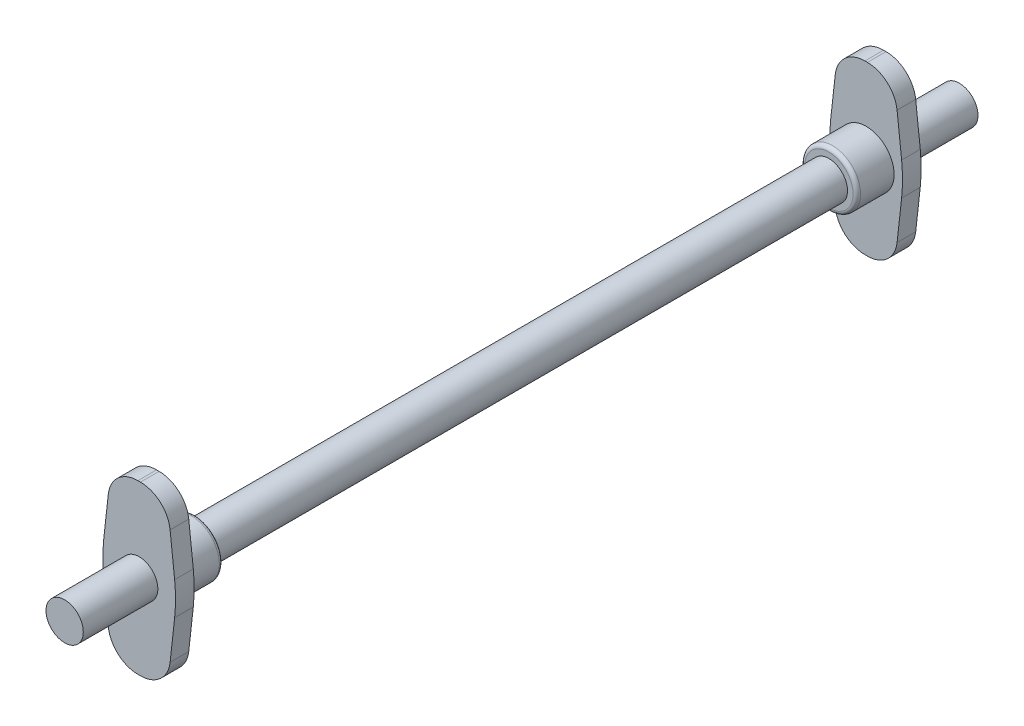
ISO-10303-21;
HEADER;
FILE_DESCRIPTION(('STEP AP214'),'2;1');
FILE_NAME('part.step','',(''),(''),'','','');
FILE_SCHEMA(('AUTOMOTIVE_DESIGN { 1 0 10303 214 1 1 1 1 }'));
ENDSEC;
DATA;
#1=APPLICATION_CONTEXT('core data for automotive mechanical design processes');
#2=APPLICATION_PROTOCOL_DEFINITION('international standard','automotive_design',2000,#1);
#3=PRODUCT_CONTEXT('',#1,'mechanical');
#4=PRODUCT('Part','Part','',(#3));
#5=PRODUCT_RELATED_PRODUCT_CATEGORY('part','',(#4));
#6=PRODUCT_DEFINITION_FORMATION('','',#4);
#7=PRODUCT_DEFINITION_CONTEXT('part definition',#1,'design');
#8=PRODUCT_DEFINITION('design','',#6,#7);
#9=PRODUCT_DEFINITION_SHAPE('','',#8);
#10=(LENGTH_UNIT() NAMED_UNIT(*) SI_UNIT(.MILLI.,.METRE.));
#11=(NAMED_UNIT(*) PLANE_ANGLE_UNIT() SI_UNIT($,.RADIAN.));
#12=(NAMED_UNIT(*) SI_UNIT($,.STERADIAN.) SOLID_ANGLE_UNIT());
#13=UNCERTAINTY_MEASURE_WITH_UNIT(LENGTH_MEASURE(1.E-05),#10,'distance_accuracy_value','');
#14=(GEOMETRIC_REPRESENTATION_CONTEXT(3) GLOBAL_UNCERTAINTY_ASSIGNED_CONTEXT((#13)) GLOBAL_UNIT_ASSIGNED_CONTEXT((#10,
#11,#12)) REPRESENTATION_CONTEXT('',''));
#15=CARTESIAN_POINT('',(0.,0.,0.));
#16=DIRECTION('',(0.,0.,1.));
#17=DIRECTION('',(1.,0.,0.));
#18=AXIS2_PLACEMENT_3D('',#15,#16,#17);
#19=CARTESIAN_POINT('',(0.,0.,53.975));
#20=DIRECTION('',(0.,0.,-1.));
#21=DIRECTION('',(-1.,0.,0.));
#22=AXIS2_PLACEMENT_3D('',#19,#20,#21);
#23=CYLINDRICAL_SURFACE('',#22,3.175);
#24=CARTESIAN_POINT('',(0.,0.,53.975));
#25=DIRECTION('',(0.,0.,1.));
#26=DIRECTION('',(1.,0.,0.));
#27=AXIS2_PLACEMENT_3D('',#24,#25,#26);
#28=CIRCLE('',#27,3.175);
#29=CARTESIAN_POINT('',(3.175,0.,53.975));
#30=VERTEX_POINT('',#29);
#31=EDGE_CURVE('E249',#30,#30,#28,.T.);
#32=ORIENTED_EDGE('',*,*,#31,.F.);
#33=EDGE_LOOP('',(#32));
#34=FACE_BOUND('',#33,.T.);
#35=CARTESIAN_POINT('',(0.,0.,-53.975));
#36=DIRECTION('',(0.,0.,1.));
#37=DIRECTION('',(1.,0.,0.));
#38=AXIS2_PLACEMENT_3D('',#35,#36,#37);
#39=CIRCLE('',#38,3.175);
#40=CARTESIAN_POINT('',(3.175,0.,-53.975));
#41=VERTEX_POINT('',#40);
#42=EDGE_CURVE('E177',#41,#41,#39,.T.);
#43=ORIENTED_EDGE('',*,*,#42,.T.);
#44=EDGE_LOOP('',(#43));
#45=FACE_BOUND('',#44,.T.);
#46=ADVANCED_FACE('F41',(#34,#45),#23,.T.);
#47=CARTESIAN_POINT('',(0.,0.,60.325));
#48=DIRECTION('',(0.,0.,-1.));
#49=DIRECTION('',(-1.,0.,0.));
#50=AXIS2_PLACEMENT_3D('',#47,#48,#49);
#51=CYLINDRICAL_SURFACE('',#50,4.7625);
#52=CARTESIAN_POINT('',(0.,0.,54.61));
#53=DIRECTION('',(0.,0.,1.));
#54=DIRECTION('',(1.,0.,0.));
#55=AXIS2_PLACEMENT_3D('',#52,#53,#54);
#56=CIRCLE('',#55,4.7625);
#57=CARTESIAN_POINT('',(4.7625,0.,54.61));
#58=VERTEX_POINT('',#57);
#59=EDGE_CURVE('E253',#58,#58,#56,.T.);
#60=ORIENTED_EDGE('',*,*,#59,.T.);
#61=EDGE_LOOP('',(#60));
#62=FACE_BOUND('',#61,.T.);
#63=CARTESIAN_POINT('',(0.,0.,60.325));
#64=DIRECTION('',(0.,0.,1.));
#65=DIRECTION('',(1.,0.,0.));
#66=AXIS2_PLACEMENT_3D('',#63,#64,#65);
#67=CIRCLE('',#66,4.7625);
#68=CARTESIAN_POINT('',(4.7625,0.,60.325));
#69=VERTEX_POINT('',#68);
#70=EDGE_CURVE('E245',#69,#69,#67,.T.);
#71=ORIENTED_EDGE('',*,*,#70,.F.);
#72=EDGE_LOOP('',(#71));
#73=FACE_BOUND('',#72,.T.);
#74=ADVANCED_FACE('F346',(#62,#73),#51,.T.);
#75=CARTESIAN_POINT('',(0.,0.,53.975));
#76=DIRECTION('',(0.,0.,1.));
#77=DIRECTION('',(1.,0.,0.));
#78=AXIS2_PLACEMENT_3D('',#75,#76,#77);
#79=PLANE('',#78);
#80=CARTESIAN_POINT('',(0.,0.,53.975));
#81=DIRECTION('',(0.,0.,1.));
#82=DIRECTION('',(1.,0.,0.));
#83=AXIS2_PLACEMENT_3D('',#80,#81,#82);
#84=CIRCLE('',#83,4.1275);
#85=CARTESIAN_POINT('',(4.1275,0.,53.975));
#86=VERTEX_POINT('',#85);
#87=EDGE_CURVE('E257',#86,#86,#84,.F.);
#88=ORIENTED_EDGE('',*,*,#87,.T.);
#89=EDGE_LOOP('',(#88));
#90=FACE_BOUND('',#89,.T.);
#91=ORIENTED_EDGE('',*,*,#31,.T.);
#92=EDGE_LOOP('',(#91));
#93=FACE_BOUND('',#92,.T.);
#94=ADVANCED_FACE('F352',(#90,#93),#79,.F.);
#95=CARTESIAN_POINT('',(-0.215682610917992,-9.2075,63.5));
#96=DIRECTION('',(0.,0.,-1.));
#97=DIRECTION('',(-1.,0.,0.));
#98=AXIS2_PLACEMENT_3D('',#95,#96,#97);
#99=CYLINDRICAL_SURFACE('',#98,5.08);
#100=CARTESIAN_POINT('',(-0.215682610917992,-9.2075,60.325));
#101=DIRECTION('',(0.,0.,1.));
#102=DIRECTION('',(-1.,0.,0.));
#103=AXIS2_PLACEMENT_3D('',#100,#101,#102);
#104=CIRCLE('',#103,5.08);
#105=CARTESIAN_POINT('',(-5.26461198305998,-9.76849215246019,60.325));
#106=VERTEX_POINT('',#105);
#107=CARTESIAN_POINT('',(-0.215682610917959,-14.2875,60.325));
#108=VERTEX_POINT('',#107);
#109=EDGE_CURVE('E172',#106,#108,#104,.T.);
#110=ORIENTED_EDGE('',*,*,#109,.T.);
#111=DIRECTION('',(0.,0.,-1.));
#112=VECTOR('',#111,1.);
#113=CARTESIAN_POINT('',(-0.215682610917959,-14.2875,63.5));
#114=LINE('',#113,#112);
#115=CARTESIAN_POINT('',(-0.215682610917959,-14.2875,63.5));
#116=VERTEX_POINT('',#115);
#117=EDGE_CURVE('E242',#116,#108,#114,.T.);
#118=ORIENTED_EDGE('',*,*,#117,.F.);
#119=CARTESIAN_POINT('',(-0.215682610917992,-9.2075,63.5));
#120=DIRECTION('',(0.,0.,1.));
#121=DIRECTION('',(-1.,0.,0.));
#122=AXIS2_PLACEMENT_3D('',#119,#120,#121);
#123=CIRCLE('',#122,5.08);
#124=CARTESIAN_POINT('',(-5.26461198305998,-9.76849215246019,63.5));
#125=VERTEX_POINT('',#124);
#126=EDGE_CURVE('E207',#125,#116,#123,.T.);
#127=ORIENTED_EDGE('',*,*,#126,.F.);
#128=DIRECTION('',(0.,0.,-1.));
#129=VECTOR('',#128,1.);
#130=CARTESIAN_POINT('',(-5.26461198305998,-9.76849215246019,63.5));
#131=LINE('',#130,#129);
#132=EDGE_CURVE('E168',#125,#106,#131,.T.);
#133=ORIENTED_EDGE('',*,*,#132,.T.);
#134=EDGE_LOOP('',(#110,#118,#127,#133));
#135=FACE_BOUND('',#134,.T.);
#136=ADVANCED_FACE('F332',(#135),#99,.T.);
#137=CARTESIAN_POINT('',(0.215682610917958,-14.2875,63.5));
#138=DIRECTION('',(0.,1.,0.));
#139=DIRECTION('',(0.,0.,1.));
#140=AXIS2_PLACEMENT_3D('',#137,#138,#139);
#141=PLANE('',#140);
#142=DIRECTION('',(1.,0.,0.));
#143=VECTOR('',#142,1.);
#144=CARTESIAN_POINT('',(0.215682610917958,-14.2875,60.325));
#145=LINE('',#144,#143);
#146=CARTESIAN_POINT('',(0.215682610917958,-14.2875,60.325));
#147=VERTEX_POINT('',#146);
#148=EDGE_CURVE('E176',#108,#147,#145,.T.);
#149=ORIENTED_EDGE('',*,*,#148,.T.);
#150=DIRECTION('',(0.,0.,-1.));
#151=VECTOR('',#150,1.);
#152=CARTESIAN_POINT('',(0.215682610917958,-14.2875,63.5));
#153=LINE('',#152,#151);
#154=CARTESIAN_POINT('',(0.215682610917958,-14.2875,63.5));
#155=VERTEX_POINT('',#154);
#156=EDGE_CURVE('E238',#155,#147,#153,.T.);
#157=ORIENTED_EDGE('',*,*,#156,.F.);
#158=DIRECTION('',(1.,0.,0.));
#159=VECTOR('',#158,1.);
#160=CARTESIAN_POINT('',(0.215682610917958,-14.2875,63.5));
#161=LINE('',#160,#159);
#162=EDGE_CURVE('E116',#116,#155,#161,.T.);
#163=ORIENTED_EDGE('',*,*,#162,.F.);
#164=ORIENTED_EDGE('',*,*,#117,.T.);
#165=EDGE_LOOP('',(#149,#157,#163,#164));
#166=FACE_BOUND('',#165,.T.);
#167=ADVANCED_FACE('F878',(#166),#141,.F.);
#168=CARTESIAN_POINT('',(0.21568261091799,-9.2075,63.5));
#169=DIRECTION('',(0.,0.,-1.));
#170=DIRECTION('',(-1.,0.,0.));
#171=AXIS2_PLACEMENT_3D('',#168,#169,#170);
#172=CYLINDRICAL_SURFACE('',#171,5.08);
#173=CARTESIAN_POINT('',(0.21568261091799,-9.2075,60.325));
#174=DIRECTION('',(0.,0.,1.));
#175=DIRECTION('',(-1.,0.,0.));
#176=AXIS2_PLACEMENT_3D('',#173,#174,#175);
#177=CIRCLE('',#176,5.08);
#178=CARTESIAN_POINT('',(5.26461198305998,-9.76849215246019,60.325));
#179=VERTEX_POINT('',#178);
#180=EDGE_CURVE('E180',#147,#179,#177,.T.);
#181=ORIENTED_EDGE('',*,*,#180,.T.);
#182=DIRECTION('',(0.,0.,-1.));
#183=VECTOR('',#182,1.);
#184=CARTESIAN_POINT('',(5.26461198305998,-9.76849215246019,63.5));
#185=LINE('',#184,#183);
#186=CARTESIAN_POINT('',(5.26461198305998,-9.76849215246019,63.5));
#187=VERTEX_POINT('',#186);
#188=EDGE_CURVE('E234',#187,#179,#185,.T.);
#189=ORIENTED_EDGE('',*,*,#188,.F.);
#190=CARTESIAN_POINT('',(0.21568261091799,-9.2075,63.5));
#191=DIRECTION('',(0.,0.,1.));
#192=DIRECTION('',(-1.,0.,0.));
#193=AXIS2_PLACEMENT_3D('',#190,#191,#192);
#194=CIRCLE('',#193,5.08);
#195=EDGE_CURVE('E298',#155,#187,#194,.T.);
#196=ORIENTED_EDGE('',*,*,#195,.F.);
#197=ORIENTED_EDGE('',*,*,#156,.T.);
#198=EDGE_LOOP('',(#181,#189,#196,#197));
#199=FACE_BOUND('',#198,.T.);
#200=ADVANCED_FACE('F884',(#199),#172,.T.);
#201=CARTESIAN_POINT('',(6.03833769307764,-2.80496076230119,63.5));
#202=DIRECTION('',(-0.993883734673619,0.110431526074847,0.));
#203=DIRECTION('',(-0.110431526074847,-0.993883734673619,0.));
#204=AXIS2_PLACEMENT_3D('',#201,#202,#203);
#205=PLANE('',#204);
#206=DIRECTION('',(0.110431526074847,0.993883734673619,0.));
#207=VECTOR('',#206,1.);
#208=CARTESIAN_POINT('',(6.03833769307764,-2.80496076230119,60.325));
#209=LINE('',#208,#207);
#210=CARTESIAN_POINT('',(6.03833769307764,-2.80496076230119,60.325));
#211=VERTEX_POINT('',#210);
#212=EDGE_CURVE('E183',#179,#211,#209,.T.);
#213=ORIENTED_EDGE('',*,*,#212,.T.);
#214=DIRECTION('',(0.,0.,-1.));
#215=VECTOR('',#214,1.);
#216=CARTESIAN_POINT('',(6.03833769307764,-2.80496076230119,63.5));
#217=LINE('',#216,#215);
#218=CARTESIAN_POINT('',(6.03833769307764,-2.80496076230119,63.5));
#219=VERTEX_POINT('',#218);
#220=EDGE_CURVE('E230',#219,#211,#217,.T.);
#221=ORIENTED_EDGE('',*,*,#220,.F.);
#222=DIRECTION('',(0.110431526074847,0.993883734673619,0.));
#223=VECTOR('',#222,1.);
#224=CARTESIAN_POINT('',(6.03833769307764,-2.80496076230119,63.5));
#225=LINE('',#224,#223);
#226=EDGE_CURVE('E301',#187,#219,#225,.T.);
#227=ORIENTED_EDGE('',*,*,#226,.F.);
#228=ORIENTED_EDGE('',*,*,#188,.T.);
#229=EDGE_LOOP('',(#213,#221,#227,#228));
#230=FACE_BOUND('',#229,.T.);
#231=ADVANCED_FACE('F891',(#230),#205,.F.);
#232=CARTESIAN_POINT('',(-19.2063091676323,0.,63.5));
#233=DIRECTION('',(0.,0.,-1.));
#234=DIRECTION('',(-1.,0.,0.));
#235=AXIS2_PLACEMENT_3D('',#232,#233,#234);
#236=CYLINDRICAL_SURFACE('',#235,25.4);
#237=CARTESIAN_POINT('',(-19.2063091676323,0.,60.325));
#238=DIRECTION('',(0.,0.,1.));
#239=DIRECTION('',(-1.,0.,0.));
#240=AXIS2_PLACEMENT_3D('',#237,#238,#239);
#241=CIRCLE('',#240,25.4);
#242=CARTESIAN_POINT('',(6.03833769307765,2.80496076230119,60.325));
#243=VERTEX_POINT('',#242);
#244=EDGE_CURVE('E186',#211,#243,#241,.T.);
#245=ORIENTED_EDGE('',*,*,#244,.T.);
#246=DIRECTION('',(0.,0.,-1.));
#247=VECTOR('',#246,1.);
#248=CARTESIAN_POINT('',(6.03833769307765,2.80496076230119,63.5));
#249=LINE('',#248,#247);
#250=CARTESIAN_POINT('',(6.03833769307765,2.80496076230119,63.5));
#251=VERTEX_POINT('',#250);
#252=EDGE_CURVE('E226',#251,#243,#249,.T.);
#253=ORIENTED_EDGE('',*,*,#252,.F.);
#254=CARTESIAN_POINT('',(-19.2063091676323,0.,63.5));
#255=DIRECTION('',(0.,0.,1.));
#256=DIRECTION('',(-1.,0.,0.));
#257=AXIS2_PLACEMENT_3D('',#254,#255,#256);
#258=CIRCLE('',#257,25.4);
#259=EDGE_CURVE('E304',#219,#251,#258,.T.);
#260=ORIENTED_EDGE('',*,*,#259,.F.);
#261=ORIENTED_EDGE('',*,*,#220,.T.);
#262=EDGE_LOOP('',(#245,#253,#260,#261));
#263=FACE_BOUND('',#262,.T.);
#264=ADVANCED_FACE('F899',(#263),#236,.T.);
#265=CARTESIAN_POINT('',(5.26461198305998,9.76849215246018,63.5));
#266=DIRECTION('',(-0.993883734673619,-0.110431526074846,0.));
#267=DIRECTION('',(0.110431526074846,-0.993883734673619,0.));
#268=AXIS2_PLACEMENT_3D('',#265,#266,#267);
#269=PLANE('',#268);
#270=DIRECTION('',(-0.110431526074846,0.993883734673619,0.));
#271=VECTOR('',#270,1.);
#272=CARTESIAN_POINT('',(5.26461198305998,9.76849215246018,60.325));
#273=LINE('',#272,#271);
#274=CARTESIAN_POINT('',(5.26461198305998,9.76849215246018,60.325));
#275=VERTEX_POINT('',#274);
#276=EDGE_CURVE('E189',#243,#275,#273,.T.);
#277=ORIENTED_EDGE('',*,*,#276,.T.);
#278=DIRECTION('',(0.,0.,-1.));
#279=VECTOR('',#278,1.);
#280=CARTESIAN_POINT('',(5.26461198305998,9.76849215246018,63.5));
#281=LINE('',#280,#279);
#282=CARTESIAN_POINT('',(5.26461198305998,9.76849215246018,63.5));
#283=VERTEX_POINT('',#282);
#284=EDGE_CURVE('E222',#283,#275,#281,.T.);
#285=ORIENTED_EDGE('',*,*,#284,.F.);
#286=DIRECTION('',(-0.110431526074846,0.993883734673619,0.));
#287=VECTOR('',#286,1.);
#288=CARTESIAN_POINT('',(5.26461198305998,9.76849215246018,63.5));
#289=LINE('',#288,#287);
#290=EDGE_CURVE('E307',#251,#283,#289,.T.);
#291=ORIENTED_EDGE('',*,*,#290,.F.);
#292=ORIENTED_EDGE('',*,*,#252,.T.);
#293=EDGE_LOOP('',(#277,#285,#291,#292));
#294=FACE_BOUND('',#293,.T.);
#295=ADVANCED_FACE('F907',(#294),#269,.F.);
#296=CARTESIAN_POINT('',(0.215682610917991,9.2075,63.5));
#297=DIRECTION('',(0.,0.,-1.));
#298=DIRECTION('',(-1.,0.,0.));
#299=AXIS2_PLACEMENT_3D('',#296,#297,#298);
#300=CYLINDRICAL_SURFACE('',#299,5.08);
#301=CARTESIAN_POINT('',(0.215682610917991,9.2075,60.325));
#302=DIRECTION('',(0.,0.,1.));
#303=DIRECTION('',(-1.,0.,0.));
#304=AXIS2_PLACEMENT_3D('',#301,#302,#303);
#305=CIRCLE('',#304,5.08);
#306=CARTESIAN_POINT('',(0.215682610917958,14.2875,60.325));
#307=VERTEX_POINT('',#306);
#308=EDGE_CURVE('E192',#275,#307,#305,.T.);
#309=ORIENTED_EDGE('',*,*,#308,.T.);
#310=DIRECTION('',(0.,0.,-1.));
#311=VECTOR('',#310,1.);
#312=CARTESIAN_POINT('',(0.215682610917958,14.2875,63.5));
#313=LINE('',#312,#311);
#314=CARTESIAN_POINT('',(0.215682610917958,14.2875,63.5));
#315=VERTEX_POINT('',#314);
#316=EDGE_CURVE('E218',#315,#307,#313,.T.);
#317=ORIENTED_EDGE('',*,*,#316,.F.);
#318=CARTESIAN_POINT('',(0.215682610917991,9.2075,63.5));
#319=DIRECTION('',(0.,0.,1.));
#320=DIRECTION('',(-1.,0.,0.));
#321=AXIS2_PLACEMENT_3D('',#318,#319,#320);
#322=CIRCLE('',#321,5.08);
#323=EDGE_CURVE('E310',#283,#315,#322,.T.);
#324=ORIENTED_EDGE('',*,*,#323,.F.);
#325=ORIENTED_EDGE('',*,*,#284,.T.);
#326=EDGE_LOOP('',(#309,#317,#324,#325));
#327=FACE_BOUND('',#326,.T.);
#328=ADVANCED_FACE('F915',(#327),#300,.T.);
#329=CARTESIAN_POINT('',(-0.215682610917959,14.2875,63.5));
#330=DIRECTION('',(0.,-1.,0.));
#331=DIRECTION('',(0.,0.,-1.));
#332=AXIS2_PLACEMENT_3D('',#329,#330,#331);
#333=PLANE('',#332);
#334=DIRECTION('',(-1.,0.,0.));
#335=VECTOR('',#334,1.);
#336=CARTESIAN_POINT('',(-0.215682610917959,14.2875,60.325));
#337=LINE('',#336,#335);
#338=CARTESIAN_POINT('',(-0.215682610917959,14.2875,60.325));
#339=VERTEX_POINT('',#338);
#340=EDGE_CURVE('E195',#307,#339,#337,.T.);
#341=ORIENTED_EDGE('',*,*,#340,.T.);
#342=DIRECTION('',(0.,0.,-1.));
#343=VECTOR('',#342,1.);
#344=CARTESIAN_POINT('',(-0.215682610917959,14.2875,63.5));
#345=LINE('',#344,#343);
#346=CARTESIAN_POINT('',(-0.215682610917959,14.2875,63.5));
#347=VERTEX_POINT('',#346);
#348=EDGE_CURVE('E214',#347,#339,#345,.T.);
#349=ORIENTED_EDGE('',*,*,#348,.F.);
#350=DIRECTION('',(-1.,0.,0.));
#351=VECTOR('',#350,1.);
#352=CARTESIAN_POINT('',(-0.215682610917959,14.2875,63.5));
#353=LINE('',#352,#351);
#354=EDGE_CURVE('E313',#315,#347,#353,.T.);
#355=ORIENTED_EDGE('',*,*,#354,.F.);
#356=ORIENTED_EDGE('',*,*,#316,.T.);
#357=EDGE_LOOP('',(#341,#349,#355,#356));
#358=FACE_BOUND('',#357,.T.);
#359=ADVANCED_FACE('F321',(#358),#333,.F.);
#360=CARTESIAN_POINT('',(-0.215682610917992,9.2075,63.5));
#361=DIRECTION('',(0.,0.,-1.));
#362=DIRECTION('',(-1.,0.,0.));
#363=AXIS2_PLACEMENT_3D('',#360,#361,#362);
#364=CYLINDRICAL_SURFACE('',#363,5.08);
#365=CARTESIAN_POINT('',(-0.215682610917992,9.2075,60.325));
#366=DIRECTION('',(0.,0.,1.));
#367=DIRECTION('',(1.,0.,0.));
#368=AXIS2_PLACEMENT_3D('',#365,#366,#367);
#369=CIRCLE('',#368,5.08);
#370=CARTESIAN_POINT('',(-5.26461198305998,9.76849215246019,60.325));
#371=VERTEX_POINT('',#370);
#372=EDGE_CURVE('E198',#339,#371,#369,.T.);
#373=ORIENTED_EDGE('',*,*,#372,.T.);
#374=DIRECTION('',(0.,0.,-1.));
#375=VECTOR('',#374,1.);
#376=CARTESIAN_POINT('',(-5.26461198305998,9.76849215246019,63.5));
#377=LINE('',#376,#375);
#378=CARTESIAN_POINT('',(-5.26461198305998,9.76849215246019,63.5));
#379=VERTEX_POINT('',#378);
#380=EDGE_CURVE('E161',#379,#371,#377,.T.);
#381=ORIENTED_EDGE('',*,*,#380,.F.);
#382=CARTESIAN_POINT('',(-0.215682610917992,9.2075,63.5));
#383=DIRECTION('',(0.,0.,1.));
#384=DIRECTION('',(1.,0.,0.));
#385=AXIS2_PLACEMENT_3D('',#382,#383,#384);
#386=CIRCLE('',#385,5.08);
#387=EDGE_CURVE('E150',#347,#379,#386,.T.);
#388=ORIENTED_EDGE('',*,*,#387,.F.);
#389=ORIENTED_EDGE('',*,*,#348,.T.);
#390=EDGE_LOOP('',(#373,#381,#388,#389));
#391=FACE_BOUND('',#390,.T.);
#392=ADVANCED_FACE('F325',(#391),#364,.T.);
#393=CARTESIAN_POINT('',(-6.03833769307765,2.8049607623012,63.5));
#394=DIRECTION('',(0.993883734673619,-0.110431526074847,0.));
#395=DIRECTION('',(0.110431526074847,0.993883734673619,0.));
#396=AXIS2_PLACEMENT_3D('',#393,#394,#395);
#397=PLANE('',#396);
#398=DIRECTION('',(-0.110431526074847,-0.993883734673619,0.));
#399=VECTOR('',#398,1.);
#400=CARTESIAN_POINT('',(-6.03833769307765,2.8049607623012,60.325));
#401=LINE('',#400,#399);
#402=CARTESIAN_POINT('',(-6.03833769307765,2.8049607623012,60.325));
#403=VERTEX_POINT('',#402);
#404=EDGE_CURVE('E159',#371,#403,#401,.T.);
#405=ORIENTED_EDGE('',*,*,#404,.T.);
#406=DIRECTION('',(0.,0.,-1.));
#407=VECTOR('',#406,1.);
#408=CARTESIAN_POINT('',(-6.03833769307765,2.8049607623012,63.5));
#409=LINE('',#408,#407);
#410=CARTESIAN_POINT('',(-6.03833769307765,2.8049607623012,63.5));
#411=VERTEX_POINT('',#410);
#412=EDGE_CURVE('E156',#411,#403,#409,.T.);
#413=ORIENTED_EDGE('',*,*,#412,.F.);
#414=DIRECTION('',(-0.110431526074847,-0.993883734673619,0.));
#415=VECTOR('',#414,1.);
#416=CARTESIAN_POINT('',(-6.03833769307765,2.8049607623012,63.5));
#417=LINE('',#416,#415);
#418=EDGE_CURVE('E144',#379,#411,#417,.T.);
#419=ORIENTED_EDGE('',*,*,#418,.F.);
#420=ORIENTED_EDGE('',*,*,#380,.T.);
#421=EDGE_LOOP('',(#405,#413,#419,#420));
#422=FACE_BOUND('',#421,.T.);
#423=ADVANCED_FACE('F157',(#422),#397,.F.);
#424=CARTESIAN_POINT('',(19.2063091676323,0.,63.5));
#425=DIRECTION('',(0.,0.,-1.));
#426=DIRECTION('',(-1.,0.,0.));
#427=AXIS2_PLACEMENT_3D('',#424,#425,#426);
#428=CYLINDRICAL_SURFACE('',#427,25.4);
#429=CARTESIAN_POINT('',(19.2063091676323,0.,60.325));
#430=DIRECTION('',(0.,0.,1.));
#431=DIRECTION('',(-1.,0.,0.));
#432=AXIS2_PLACEMENT_3D('',#429,#430,#431);
#433=CIRCLE('',#432,25.4);
#434=CARTESIAN_POINT('',(-6.03833769307765,-2.8049607623012,60.325));
#435=VERTEX_POINT('',#434);
#436=EDGE_CURVE('E101',#403,#435,#433,.T.);
#437=ORIENTED_EDGE('',*,*,#436,.T.);
#438=DIRECTION('',(0.,0.,-1.));
#439=VECTOR('',#438,1.);
#440=CARTESIAN_POINT('',(-6.03833769307765,-2.8049607623012,63.5));
#441=LINE('',#440,#439);
#442=CARTESIAN_POINT('',(-6.03833769307765,-2.8049607623012,63.5));
#443=VERTEX_POINT('',#442);
#444=EDGE_CURVE('E162',#443,#435,#441,.T.);
#445=ORIENTED_EDGE('',*,*,#444,.F.);
#446=CARTESIAN_POINT('',(19.2063091676323,0.,63.5));
#447=DIRECTION('',(0.,0.,1.));
#448=DIRECTION('',(-1.,0.,0.));
#449=AXIS2_PLACEMENT_3D('',#446,#447,#448);
#450=CIRCLE('',#449,25.4);
#451=EDGE_CURVE('E148',#411,#443,#450,.T.);
#452=ORIENTED_EDGE('',*,*,#451,.F.);
#453=ORIENTED_EDGE('',*,*,#412,.T.);
#454=EDGE_LOOP('',(#437,#445,#452,#453));
#455=FACE_BOUND('',#454,.T.);
#456=ADVANCED_FACE('F164',(#455),#428,.T.);
#457=CARTESIAN_POINT('',(-5.26461198305998,-9.76849215246019,63.5));
#458=DIRECTION('',(0.993883734673619,0.110431526074847,0.));
#459=DIRECTION('',(-0.110431526074847,0.993883734673619,0.));
#460=AXIS2_PLACEMENT_3D('',#457,#458,#459);
#461=PLANE('',#460);
#462=DIRECTION('',(0.110431526074847,-0.993883734673619,0.));
#463=VECTOR('',#462,1.);
#464=CARTESIAN_POINT('',(-5.26461198305998,-9.76849215246019,60.325));
#465=LINE('',#464,#463);
#466=EDGE_CURVE('E107',#435,#106,#465,.T.);
#467=ORIENTED_EDGE('',*,*,#466,.T.);
#468=ORIENTED_EDGE('',*,*,#132,.F.);
#469=DIRECTION('',(0.110431526074847,-0.993883734673619,0.));
#470=VECTOR('',#469,1.);
#471=CARTESIAN_POINT('',(-5.26461198305998,-9.76849215246019,63.5));
#472=LINE('',#471,#470);
#473=EDGE_CURVE('E59',#443,#125,#472,.T.);
#474=ORIENTED_EDGE('',*,*,#473,.F.);
#475=ORIENTED_EDGE('',*,*,#444,.T.);
#476=EDGE_LOOP('',(#467,#468,#474,#475));
#477=FACE_BOUND('',#476,.T.);
#478=ADVANCED_FACE('F334',(#477),#461,.F.);
#479=CARTESIAN_POINT('',(-0.215682610917992,-9.2075,63.5));
#480=DIRECTION('',(0.,0.,-1.));
#481=DIRECTION('',(-1.,0.,0.));
#482=AXIS2_PLACEMENT_3D('',#479,#480,#481);
#483=PLANE('',#482);
#484=CARTESIAN_POINT('',(0.,0.,63.5));
#485=DIRECTION('',(0.,0.,-1.));
#486=DIRECTION('',(-1.,0.,0.));
#487=AXIS2_PLACEMENT_3D('',#484,#485,#486);
#488=CIRCLE('',#487,3.175);
#489=CARTESIAN_POINT('',(-3.175,0.,63.5));
#490=VERTEX_POINT('',#489);
#491=EDGE_CURVE('E11',#490,#490,#488,.F.);
#492=ORIENTED_EDGE('',*,*,#491,.F.);
#493=EDGE_LOOP('',(#492));
#494=FACE_BOUND('',#493,.T.);
#495=ORIENTED_EDGE('',*,*,#126,.T.);
#496=ORIENTED_EDGE('',*,*,#162,.T.);
#497=ORIENTED_EDGE('',*,*,#195,.T.);
#498=ORIENTED_EDGE('',*,*,#226,.T.);
#499=ORIENTED_EDGE('',*,*,#259,.T.);
#500=ORIENTED_EDGE('',*,*,#290,.T.);
#501=ORIENTED_EDGE('',*,*,#323,.T.);
#502=ORIENTED_EDGE('',*,*,#354,.T.);
#503=ORIENTED_EDGE('',*,*,#387,.T.);
#504=ORIENTED_EDGE('',*,*,#418,.T.);
#505=ORIENTED_EDGE('',*,*,#451,.T.);
#506=ORIENTED_EDGE('',*,*,#473,.T.);
#507=EDGE_LOOP('',(#495,#496,#497,#498,#499,#500,#501,#502,#503,#504,#505,#506));
#508=FACE_BOUND('',#507,.T.);
#509=ADVANCED_FACE('F146',(#494,#508),#483,.F.);
#510=CARTESIAN_POINT('',(-0.215682610917992,-9.2075,60.325));
#511=DIRECTION('',(0.,0.,-1.));
#512=DIRECTION('',(-1.,0.,0.));
#513=AXIS2_PLACEMENT_3D('',#510,#511,#512);
#514=PLANE('',#513);
#515=ORIENTED_EDGE('',*,*,#70,.T.);
#516=EDGE_LOOP('',(#515));
#517=FACE_BOUND('',#516,.T.);
#518=ORIENTED_EDGE('',*,*,#109,.F.);
#519=ORIENTED_EDGE('',*,*,#466,.F.);
#520=ORIENTED_EDGE('',*,*,#436,.F.);
#521=ORIENTED_EDGE('',*,*,#404,.F.);
#522=ORIENTED_EDGE('',*,*,#372,.F.);
#523=ORIENTED_EDGE('',*,*,#340,.F.);
#524=ORIENTED_EDGE('',*,*,#308,.F.);
#525=ORIENTED_EDGE('',*,*,#276,.F.);
#526=ORIENTED_EDGE('',*,*,#244,.F.);
#527=ORIENTED_EDGE('',*,*,#212,.F.);
#528=ORIENTED_EDGE('',*,*,#180,.F.);
#529=ORIENTED_EDGE('',*,*,#148,.F.);
#530=EDGE_LOOP('',(#518,#519,#520,#521,#522,#523,#524,#525,#526,#527,#528,#529));
#531=FACE_BOUND('',#530,.T.);
#532=ADVANCED_FACE('F328',(#517,#531),#514,.T.);
#533=CARTESIAN_POINT('',(0.,0.,-60.325));
#534=DIRECTION('',(0.,0.,1.));
#535=DIRECTION('',(1.,0.,0.));
#536=AXIS2_PLACEMENT_3D('',#533,#534,#535);
#537=CYLINDRICAL_SURFACE('',#536,4.7625);
#538=CARTESIAN_POINT('',(0.,0.,-54.61));
#539=DIRECTION('',(0.,0.,-1.));
#540=DIRECTION('',(-1.,0.,0.));
#541=AXIS2_PLACEMENT_3D('',#538,#539,#540);
#542=CIRCLE('',#541,4.7625);
#543=CARTESIAN_POINT('',(-4.7625,0.,-54.61));
#544=VERTEX_POINT('',#543);
#545=EDGE_CURVE('E51',#544,#544,#542,.T.);
#546=ORIENTED_EDGE('',*,*,#545,.T.);
#547=EDGE_LOOP('',(#546));
#548=FACE_BOUND('',#547,.T.);
#549=CARTESIAN_POINT('',(0.,0.,-60.325));
#550=DIRECTION('',(0.,0.,1.));
#551=DIRECTION('',(1.,0.,0.));
#552=AXIS2_PLACEMENT_3D('',#549,#550,#551);
#553=CIRCLE('',#552,4.7625);
#554=CARTESIAN_POINT('',(4.7625,0.,-60.325));
#555=VERTEX_POINT('',#554);
#556=EDGE_CURVE('E286',#555,#555,#553,.T.);
#557=ORIENTED_EDGE('',*,*,#556,.T.);
#558=EDGE_LOOP('',(#557));
#559=FACE_BOUND('',#558,.T.);
#560=ADVANCED_FACE('F268',(#548,#559),#537,.T.);
#561=CARTESIAN_POINT('',(0.,0.,-53.975));
#562=DIRECTION('',(0.,0.,-1.));
#563=DIRECTION('',(1.,0.,0.));
#564=AXIS2_PLACEMENT_3D('',#561,#562,#563);
#565=PLANE('',#564);
#566=CARTESIAN_POINT('',(0.,0.,-53.975));
#567=DIRECTION('',(0.,0.,-1.));
#568=DIRECTION('',(-1.,0.,0.));
#569=AXIS2_PLACEMENT_3D('',#566,#567,#568);
#570=CIRCLE('',#569,4.1275);
#571=CARTESIAN_POINT('',(-4.1275,0.,-53.975));
#572=VERTEX_POINT('',#571);
#573=EDGE_CURVE('E261',#572,#572,#570,.F.);
#574=ORIENTED_EDGE('',*,*,#573,.T.);
#575=EDGE_LOOP('',(#574));
#576=FACE_BOUND('',#575,.T.);
#577=ORIENTED_EDGE('',*,*,#42,.F.);
#578=EDGE_LOOP('',(#577));
#579=FACE_BOUND('',#578,.T.);
#580=ADVANCED_FACE('F277',(#576,#579),#565,.F.);
#581=CARTESIAN_POINT('',(-0.215682610917992,-9.2075,-63.5));
#582=DIRECTION('',(0.,0.,1.));
#583=DIRECTION('',(1.,0.,0.));
#584=AXIS2_PLACEMENT_3D('',#581,#582,#583);
#585=CYLINDRICAL_SURFACE('',#584,5.08);
#586=CARTESIAN_POINT('',(-0.215682610917992,-9.2075,-60.325));
#587=DIRECTION('',(0.,0.,1.));
#588=DIRECTION('',(-1.,0.,0.));
#589=AXIS2_PLACEMENT_3D('',#586,#587,#588);
#590=CIRCLE('',#589,5.08);
#591=CARTESIAN_POINT('',(-5.26461198305998,-9.76849215246019,-60.325));
#592=VERTEX_POINT('',#591);
#593=CARTESIAN_POINT('',(-0.215682610917959,-14.2875,-60.325));
#594=VERTEX_POINT('',#593);
#595=EDGE_CURVE('E454',#592,#594,#590,.T.);
#596=ORIENTED_EDGE('',*,*,#595,.F.);
#597=DIRECTION('',(0.,0.,1.));
#598=VECTOR('',#597,1.);
#599=CARTESIAN_POINT('',(-5.26461198305998,-9.76849215246019,-63.5));
#600=LINE('',#599,#598);
#601=CARTESIAN_POINT('',(-5.26461198305998,-9.76849215246019,-63.5));
#602=VERTEX_POINT('',#601);
#603=EDGE_CURVE('E290',#602,#592,#600,.T.);
#604=ORIENTED_EDGE('',*,*,#603,.F.);
#605=CARTESIAN_POINT('',(-0.215682610917992,-9.2075,-63.5));
#606=DIRECTION('',(0.,0.,1.));
#607=DIRECTION('',(-1.,0.,0.));
#608=AXIS2_PLACEMENT_3D('',#605,#606,#607);
#609=CIRCLE('',#608,5.08);
#610=CARTESIAN_POINT('',(-0.215682610917959,-14.2875,-63.5));
#611=VERTEX_POINT('',#610);
#612=EDGE_CURVE('E459',#602,#611,#609,.T.);
#613=ORIENTED_EDGE('',*,*,#612,.T.);
#614=DIRECTION('',(0.,0.,1.));
#615=VECTOR('',#614,1.);
#616=CARTESIAN_POINT('',(-0.215682610917959,-14.2875,-63.5));
#617=LINE('',#616,#615);
#618=EDGE_CURVE('E508',#611,#594,#617,.T.);
#619=ORIENTED_EDGE('',*,*,#618,.T.);
#620=EDGE_LOOP('',(#596,#604,#613,#619));
#621=FACE_BOUND('',#620,.T.);
#622=ADVANCED_FACE('F280',(#621),#585,.T.);
#623=CARTESIAN_POINT('',(-5.26461198305998,-9.76849215246019,-63.5));
#624=DIRECTION('',(-0.993883734673619,-0.110431526074847,0.));
#625=DIRECTION('',(0.110431526074847,-0.993883734673619,0.));
#626=AXIS2_PLACEMENT_3D('',#623,#624,#625);
#627=PLANE('',#626);
#628=DIRECTION('',(0.110431526074847,-0.993883734673619,0.));
#629=VECTOR('',#628,1.);
#630=CARTESIAN_POINT('',(-5.26461198305998,-9.76849215246019,-60.325));
#631=LINE('',#630,#629);
#632=CARTESIAN_POINT('',(-6.03833769307765,-2.8049607623012,-60.325));
#633=VERTEX_POINT('',#632);
#634=EDGE_CURVE('E512',#633,#592,#631,.T.);
#635=ORIENTED_EDGE('',*,*,#634,.F.);
#636=DIRECTION('',(0.,0.,1.));
#637=VECTOR('',#636,1.);
#638=CARTESIAN_POINT('',(-6.03833769307765,-2.8049607623012,-63.5));
#639=LINE('',#638,#637);
#640=CARTESIAN_POINT('',(-6.03833769307765,-2.8049607623012,-63.5));
#641=VERTEX_POINT('',#640);
#642=EDGE_CURVE('E594',#641,#633,#639,.T.);
#643=ORIENTED_EDGE('',*,*,#642,.F.);
#644=DIRECTION('',(0.110431526074847,-0.993883734673619,0.));
#645=VECTOR('',#644,1.);
#646=CARTESIAN_POINT('',(-5.26461198305998,-9.76849215246019,-63.5));
#647=LINE('',#646,#645);
#648=EDGE_CURVE('E463',#641,#602,#647,.T.);
#649=ORIENTED_EDGE('',*,*,#648,.T.);
#650=ORIENTED_EDGE('',*,*,#603,.T.);
#651=EDGE_LOOP('',(#635,#643,#649,#650));
#652=FACE_BOUND('',#651,.T.);
#653=ADVANCED_FACE('F380',(#652),#627,.T.);
#654=CARTESIAN_POINT('',(19.2063091676323,0.,-63.5));
#655=DIRECTION('',(0.,0.,1.));
#656=DIRECTION('',(1.,0.,0.));
#657=AXIS2_PLACEMENT_3D('',#654,#655,#656);
#658=CYLINDRICAL_SURFACE('',#657,25.4);
#659=CARTESIAN_POINT('',(19.2063091676323,0.,-60.325));
#660=DIRECTION('',(0.,0.,1.));
#661=DIRECTION('',(-1.,0.,0.));
#662=AXIS2_PLACEMENT_3D('',#659,#660,#661);
#663=CIRCLE('',#662,25.4);
#664=CARTESIAN_POINT('',(-6.03833769307765,2.8049607623012,-60.325));
#665=VERTEX_POINT('',#664);
#666=EDGE_CURVE('E516',#665,#633,#663,.T.);
#667=ORIENTED_EDGE('',*,*,#666,.F.);
#668=DIRECTION('',(0.,0.,1.));
#669=VECTOR('',#668,1.);
#670=CARTESIAN_POINT('',(-6.03833769307765,2.8049607623012,-63.5));
#671=LINE('',#670,#669);
#672=CARTESIAN_POINT('',(-6.03833769307765,2.8049607623012,-63.5));
#673=VERTEX_POINT('',#672);
#674=EDGE_CURVE('E590',#673,#665,#671,.T.);
#675=ORIENTED_EDGE('',*,*,#674,.F.);
#676=CARTESIAN_POINT('',(19.2063091676323,0.,-63.5));
#677=DIRECTION('',(0.,0.,1.));
#678=DIRECTION('',(-1.,0.,0.));
#679=AXIS2_PLACEMENT_3D('',#676,#677,#678);
#680=CIRCLE('',#679,25.4);
#681=EDGE_CURVE('E468',#673,#641,#680,.T.);
#682=ORIENTED_EDGE('',*,*,#681,.T.);
#683=ORIENTED_EDGE('',*,*,#642,.T.);
#684=EDGE_LOOP('',(#667,#675,#682,#683));
#685=FACE_BOUND('',#684,.T.);
#686=ADVANCED_FACE('F384',(#685),#658,.T.);
#687=CARTESIAN_POINT('',(-6.03833769307765,2.8049607623012,-63.5));
#688=DIRECTION('',(-0.993883734673619,0.110431526074847,0.));
#689=DIRECTION('',(-0.110431526074847,-0.993883734673619,0.));
#690=AXIS2_PLACEMENT_3D('',#687,#688,#689);
#691=PLANE('',#690);
#692=DIRECTION('',(-0.110431526074847,-0.993883734673619,0.));
#693=VECTOR('',#692,1.);
#694=CARTESIAN_POINT('',(-6.03833769307765,2.8049607623012,-60.325));
#695=LINE('',#694,#693);
#696=CARTESIAN_POINT('',(-5.26461198305998,9.76849215246019,-60.325));
#697=VERTEX_POINT('',#696);
#698=EDGE_CURVE('E520',#697,#665,#695,.T.);
#699=ORIENTED_EDGE('',*,*,#698,.F.);
#700=DIRECTION('',(0.,0.,1.));
#701=VECTOR('',#700,1.);
#702=CARTESIAN_POINT('',(-5.26461198305998,9.76849215246019,-63.5));
#703=LINE('',#702,#701);
#704=CARTESIAN_POINT('',(-5.26461198305998,9.76849215246019,-63.5));
#705=VERTEX_POINT('',#704);
#706=EDGE_CURVE('E586',#705,#697,#703,.T.);
#707=ORIENTED_EDGE('',*,*,#706,.F.);
#708=DIRECTION('',(-0.110431526074847,-0.993883734673619,0.));
#709=VECTOR('',#708,1.);
#710=CARTESIAN_POINT('',(-6.03833769307765,2.8049607623012,-63.5));
#711=LINE('',#710,#709);
#712=EDGE_CURVE('E472',#705,#673,#711,.T.);
#713=ORIENTED_EDGE('',*,*,#712,.T.);
#714=ORIENTED_EDGE('',*,*,#674,.T.);
#715=EDGE_LOOP('',(#699,#707,#713,#714));
#716=FACE_BOUND('',#715,.T.);
#717=ADVANCED_FACE('F388',(#716),#691,.T.);
#718=CARTESIAN_POINT('',(-0.215682610917992,9.2075,-63.5));
#719=DIRECTION('',(0.,0.,1.));
#720=DIRECTION('',(1.,0.,0.));
#721=AXIS2_PLACEMENT_3D('',#718,#719,#720);
#722=CYLINDRICAL_SURFACE('',#721,5.08);
#723=CARTESIAN_POINT('',(-0.215682610917992,9.2075,-60.325));
#724=DIRECTION('',(0.,0.,1.));
#725=DIRECTION('',(1.,0.,0.));
#726=AXIS2_PLACEMENT_3D('',#723,#724,#725);
#727=CIRCLE('',#726,5.08);
#728=CARTESIAN_POINT('',(-0.215682610917959,14.2875,-60.325));
#729=VERTEX_POINT('',#728);
#730=EDGE_CURVE('E524',#729,#697,#727,.T.);
#731=ORIENTED_EDGE('',*,*,#730,.F.);
#732=DIRECTION('',(0.,0.,1.));
#733=VECTOR('',#732,1.);
#734=CARTESIAN_POINT('',(-0.215682610917959,14.2875,-63.5));
#735=LINE('',#734,#733);
#736=CARTESIAN_POINT('',(-0.215682610917959,14.2875,-63.5));
#737=VERTEX_POINT('',#736);
#738=EDGE_CURVE('E582',#737,#729,#735,.T.);
#739=ORIENTED_EDGE('',*,*,#738,.F.);
#740=CARTESIAN_POINT('',(-0.215682610917992,9.2075,-63.5));
#741=DIRECTION('',(0.,0.,1.));
#742=DIRECTION('',(1.,0.,0.));
#743=AXIS2_PLACEMENT_3D('',#740,#741,#742);
#744=CIRCLE('',#743,5.08);
#745=EDGE_CURVE('E476',#737,#705,#744,.T.);
#746=ORIENTED_EDGE('',*,*,#745,.T.);
#747=ORIENTED_EDGE('',*,*,#706,.T.);
#748=EDGE_LOOP('',(#731,#739,#746,#747));
#749=FACE_BOUND('',#748,.T.);
#750=ADVANCED_FACE('F392',(#749),#722,.T.);
#751=CARTESIAN_POINT('',(-0.215682610917959,14.2875,-63.5));
#752=DIRECTION('',(0.,1.,0.));
#753=DIRECTION('',(0.,0.,1.));
#754=AXIS2_PLACEMENT_3D('',#751,#752,#753);
#755=PLANE('',#754);
#756=DIRECTION('',(-1.,0.,0.));
#757=VECTOR('',#756,1.);
#758=CARTESIAN_POINT('',(-0.215682610917959,14.2875,-60.325));
#759=LINE('',#758,#757);
#760=CARTESIAN_POINT('',(0.215682610917958,14.2875,-60.325));
#761=VERTEX_POINT('',#760);
#762=EDGE_CURVE('E528',#761,#729,#759,.T.);
#763=ORIENTED_EDGE('',*,*,#762,.F.);
#764=DIRECTION('',(0.,0.,1.));
#765=VECTOR('',#764,1.);
#766=CARTESIAN_POINT('',(0.215682610917958,14.2875,-63.5));
#767=LINE('',#766,#765);
#768=CARTESIAN_POINT('',(0.215682610917958,14.2875,-63.5));
#769=VERTEX_POINT('',#768);
#770=EDGE_CURVE('E578',#769,#761,#767,.T.);
#771=ORIENTED_EDGE('',*,*,#770,.F.);
#772=DIRECTION('',(-1.,0.,0.));
#773=VECTOR('',#772,1.);
#774=CARTESIAN_POINT('',(-0.215682610917959,14.2875,-63.5));
#775=LINE('',#774,#773);
#776=EDGE_CURVE('E480',#769,#737,#775,.T.);
#777=ORIENTED_EDGE('',*,*,#776,.T.);
#778=ORIENTED_EDGE('',*,*,#738,.T.);
#779=EDGE_LOOP('',(#763,#771,#777,#778));
#780=FACE_BOUND('',#779,.T.);
#781=ADVANCED_FACE('F396',(#780),#755,.T.);
#782=CARTESIAN_POINT('',(0.215682610917991,9.2075,-63.5));
#783=DIRECTION('',(0.,0.,1.));
#784=DIRECTION('',(1.,0.,0.));
#785=AXIS2_PLACEMENT_3D('',#782,#783,#784);
#786=CYLINDRICAL_SURFACE('',#785,5.08);
#787=CARTESIAN_POINT('',(0.215682610917991,9.2075,-60.325));
#788=DIRECTION('',(0.,0.,1.));
#789=DIRECTION('',(-1.,0.,0.));
#790=AXIS2_PLACEMENT_3D('',#787,#788,#789);
#791=CIRCLE('',#790,5.08);
#792=CARTESIAN_POINT('',(5.26461198305998,9.76849215246018,-60.325));
#793=VERTEX_POINT('',#792);
#794=EDGE_CURVE('E532',#793,#761,#791,.T.);
#795=ORIENTED_EDGE('',*,*,#794,.F.);
#796=DIRECTION('',(0.,0.,1.));
#797=VECTOR('',#796,1.);
#798=CARTESIAN_POINT('',(5.26461198305998,9.76849215246018,-63.5));
#799=LINE('',#798,#797);
#800=CARTESIAN_POINT('',(5.26461198305998,9.76849215246018,-63.5));
#801=VERTEX_POINT('',#800);
#802=EDGE_CURVE('E574',#801,#793,#799,.T.);
#803=ORIENTED_EDGE('',*,*,#802,.F.);
#804=CARTESIAN_POINT('',(0.215682610917991,9.2075,-63.5));
#805=DIRECTION('',(0.,0.,1.));
#806=DIRECTION('',(-1.,0.,0.));
#807=AXIS2_PLACEMENT_3D('',#804,#805,#806);
#808=CIRCLE('',#807,5.08);
#809=EDGE_CURVE('E484',#801,#769,#808,.T.);
#810=ORIENTED_EDGE('',*,*,#809,.T.);
#811=ORIENTED_EDGE('',*,*,#770,.T.);
#812=EDGE_LOOP('',(#795,#803,#810,#811));
#813=FACE_BOUND('',#812,.T.);
#814=ADVANCED_FACE('F400',(#813),#786,.T.);
#815=CARTESIAN_POINT('',(5.26461198305998,9.76849215246018,-63.5));
#816=DIRECTION('',(0.993883734673619,0.110431526074846,0.));
#817=DIRECTION('',(-0.110431526074846,0.993883734673619,0.));
#818=AXIS2_PLACEMENT_3D('',#815,#816,#817);
#819=PLANE('',#818);
#820=DIRECTION('',(-0.110431526074846,0.993883734673619,0.));
#821=VECTOR('',#820,1.);
#822=CARTESIAN_POINT('',(5.26461198305998,9.76849215246018,-60.325));
#823=LINE('',#822,#821);
#824=CARTESIAN_POINT('',(6.03833769307765,2.80496076230119,-60.325));
#825=VERTEX_POINT('',#824);
#826=EDGE_CURVE('E536',#825,#793,#823,.T.);
#827=ORIENTED_EDGE('',*,*,#826,.F.);
#828=DIRECTION('',(0.,0.,1.));
#829=VECTOR('',#828,1.);
#830=CARTESIAN_POINT('',(6.03833769307765,2.80496076230119,-63.5));
#831=LINE('',#830,#829);
#832=CARTESIAN_POINT('',(6.03833769307765,2.80496076230119,-63.5));
#833=VERTEX_POINT('',#832);
#834=EDGE_CURVE('E570',#833,#825,#831,.T.);
#835=ORIENTED_EDGE('',*,*,#834,.F.);
#836=DIRECTION('',(-0.110431526074846,0.993883734673619,0.));
#837=VECTOR('',#836,1.);
#838=CARTESIAN_POINT('',(5.26461198305998,9.76849215246018,-63.5));
#839=LINE('',#838,#837);
#840=EDGE_CURVE('E488',#833,#801,#839,.T.);
#841=ORIENTED_EDGE('',*,*,#840,.T.);
#842=ORIENTED_EDGE('',*,*,#802,.T.);
#843=EDGE_LOOP('',(#827,#835,#841,#842));
#844=FACE_BOUND('',#843,.T.);
#845=ADVANCED_FACE('F404',(#844),#819,.T.);
#846=CARTESIAN_POINT('',(-19.2063091676323,0.,-63.5));
#847=DIRECTION('',(0.,0.,1.));
#848=DIRECTION('',(1.,0.,0.));
#849=AXIS2_PLACEMENT_3D('',#846,#847,#848);
#850=CYLINDRICAL_SURFACE('',#849,25.4);
#851=CARTESIAN_POINT('',(-19.2063091676323,0.,-60.325));
#852=DIRECTION('',(0.,0.,1.));
#853=DIRECTION('',(-1.,0.,0.));
#854=AXIS2_PLACEMENT_3D('',#851,#852,#853);
#855=CIRCLE('',#854,25.4);
#856=CARTESIAN_POINT('',(6.03833769307764,-2.80496076230119,-60.325));
#857=VERTEX_POINT('',#856);
#858=EDGE_CURVE('E540',#857,#825,#855,.T.);
#859=ORIENTED_EDGE('',*,*,#858,.F.);
#860=DIRECTION('',(0.,0.,1.));
#861=VECTOR('',#860,1.);
#862=CARTESIAN_POINT('',(6.03833769307764,-2.80496076230119,-63.5));
#863=LINE('',#862,#861);
#864=CARTESIAN_POINT('',(6.03833769307764,-2.80496076230119,-63.5));
#865=VERTEX_POINT('',#864);
#866=EDGE_CURVE('E566',#865,#857,#863,.T.);
#867=ORIENTED_EDGE('',*,*,#866,.F.);
#868=CARTESIAN_POINT('',(-19.2063091676323,0.,-63.5));
#869=DIRECTION('',(0.,0.,1.));
#870=DIRECTION('',(-1.,0.,0.));
#871=AXIS2_PLACEMENT_3D('',#868,#869,#870);
#872=CIRCLE('',#871,25.4);
#873=EDGE_CURVE('E492',#865,#833,#872,.T.);
#874=ORIENTED_EDGE('',*,*,#873,.T.);
#875=ORIENTED_EDGE('',*,*,#834,.T.);
#876=EDGE_LOOP('',(#859,#867,#874,#875));
#877=FACE_BOUND('',#876,.T.);
#878=ADVANCED_FACE('F408',(#877),#850,.T.);
#879=CARTESIAN_POINT('',(6.03833769307764,-2.80496076230119,-63.5));
#880=DIRECTION('',(0.993883734673619,-0.110431526074847,0.));
#881=DIRECTION('',(0.110431526074847,0.993883734673619,0.));
#882=AXIS2_PLACEMENT_3D('',#879,#880,#881);
#883=PLANE('',#882);
#884=DIRECTION('',(0.110431526074847,0.993883734673619,0.));
#885=VECTOR('',#884,1.);
#886=CARTESIAN_POINT('',(6.03833769307764,-2.80496076230119,-60.325));
#887=LINE('',#886,#885);
#888=CARTESIAN_POINT('',(5.26461198305998,-9.76849215246019,-60.325));
#889=VERTEX_POINT('',#888);
#890=EDGE_CURVE('E544',#889,#857,#887,.T.);
#891=ORIENTED_EDGE('',*,*,#890,.F.);
#892=DIRECTION('',(0.,0.,1.));
#893=VECTOR('',#892,1.);
#894=CARTESIAN_POINT('',(5.26461198305998,-9.76849215246019,-63.5));
#895=LINE('',#894,#893);
#896=CARTESIAN_POINT('',(5.26461198305998,-9.76849215246019,-63.5));
#897=VERTEX_POINT('',#896);
#898=EDGE_CURVE('E562',#897,#889,#895,.T.);
#899=ORIENTED_EDGE('',*,*,#898,.F.);
#900=DIRECTION('',(0.110431526074847,0.993883734673619,0.));
#901=VECTOR('',#900,1.);
#902=CARTESIAN_POINT('',(6.03833769307764,-2.80496076230119,-63.5));
#903=LINE('',#902,#901);
#904=EDGE_CURVE('E496',#897,#865,#903,.T.);
#905=ORIENTED_EDGE('',*,*,#904,.T.);
#906=ORIENTED_EDGE('',*,*,#866,.T.);
#907=EDGE_LOOP('',(#891,#899,#905,#906));
#908=FACE_BOUND('',#907,.T.);
#909=ADVANCED_FACE('F412',(#908),#883,.T.);
#910=CARTESIAN_POINT('',(0.21568261091799,-9.2075,-63.5));
#911=DIRECTION('',(0.,0.,1.));
#912=DIRECTION('',(1.,0.,0.));
#913=AXIS2_PLACEMENT_3D('',#910,#911,#912);
#914=CYLINDRICAL_SURFACE('',#913,5.08);
#915=CARTESIAN_POINT('',(0.21568261091799,-9.2075,-60.325));
#916=DIRECTION('',(0.,0.,1.));
#917=DIRECTION('',(-1.,0.,0.));
#918=AXIS2_PLACEMENT_3D('',#915,#916,#917);
#919=CIRCLE('',#918,5.08);
#920=CARTESIAN_POINT('',(0.215682610917958,-14.2875,-60.325));
#921=VERTEX_POINT('',#920);
#922=EDGE_CURVE('E548',#921,#889,#919,.T.);
#923=ORIENTED_EDGE('',*,*,#922,.F.);
#924=DIRECTION('',(0.,0.,1.));
#925=VECTOR('',#924,1.);
#926=CARTESIAN_POINT('',(0.215682610917958,-14.2875,-63.5));
#927=LINE('',#926,#925);
#928=CARTESIAN_POINT('',(0.215682610917958,-14.2875,-63.5));
#929=VERTEX_POINT('',#928);
#930=EDGE_CURVE('E558',#929,#921,#927,.T.);
#931=ORIENTED_EDGE('',*,*,#930,.F.);
#932=CARTESIAN_POINT('',(0.21568261091799,-9.2075,-63.5));
#933=DIRECTION('',(0.,0.,1.));
#934=DIRECTION('',(-1.,0.,0.));
#935=AXIS2_PLACEMENT_3D('',#932,#933,#934);
#936=CIRCLE('',#935,5.08);
#937=EDGE_CURVE('E500',#929,#897,#936,.T.);
#938=ORIENTED_EDGE('',*,*,#937,.T.);
#939=ORIENTED_EDGE('',*,*,#898,.T.);
#940=EDGE_LOOP('',(#923,#931,#938,#939));
#941=FACE_BOUND('',#940,.T.);
#942=ADVANCED_FACE('F416',(#941),#914,.T.);
#943=CARTESIAN_POINT('',(0.215682610917958,-14.2875,-63.5));
#944=DIRECTION('',(0.,-1.,0.));
#945=DIRECTION('',(0.,0.,-1.));
#946=AXIS2_PLACEMENT_3D('',#943,#944,#945);
#947=PLANE('',#946);
#948=DIRECTION('',(1.,0.,0.));
#949=VECTOR('',#948,1.);
#950=CARTESIAN_POINT('',(0.215682610917958,-14.2875,-60.325));
#951=LINE('',#950,#949);
#952=EDGE_CURVE('E464',#594,#921,#951,.T.);
#953=ORIENTED_EDGE('',*,*,#952,.F.);
#954=ORIENTED_EDGE('',*,*,#618,.F.);
#955=DIRECTION('',(1.,0.,0.));
#956=VECTOR('',#955,1.);
#957=CARTESIAN_POINT('',(0.215682610917958,-14.2875,-63.5));
#958=LINE('',#957,#956);
#959=EDGE_CURVE('E504',#611,#929,#958,.T.);
#960=ORIENTED_EDGE('',*,*,#959,.T.);
#961=ORIENTED_EDGE('',*,*,#930,.T.);
#962=EDGE_LOOP('',(#953,#954,#960,#961));
#963=FACE_BOUND('',#962,.T.);
#964=ADVANCED_FACE('F420',(#963),#947,.T.);
#965=CARTESIAN_POINT('',(-0.215682610917992,-9.2075,-63.5));
#966=DIRECTION('',(0.,0.,1.));
#967=DIRECTION('',(-1.,0.,0.));
#968=AXIS2_PLACEMENT_3D('',#965,#966,#967);
#969=PLANE('',#968);
#970=CARTESIAN_POINT('',(0.,0.,-63.5));
#971=DIRECTION('',(0.,0.,1.));
#972=DIRECTION('',(1.,0.,0.));
#973=AXIS2_PLACEMENT_3D('',#970,#971,#972);
#974=CIRCLE('',#973,3.175);
#975=CARTESIAN_POINT('',(3.175,0.,-63.5));
#976=VERTEX_POINT('',#975);
#977=EDGE_CURVE('E449',#976,#976,#974,.T.);
#978=ORIENTED_EDGE('',*,*,#977,.T.);
#979=EDGE_LOOP('',(#978));
#980=FACE_BOUND('',#979,.T.);
#981=ORIENTED_EDGE('',*,*,#612,.F.);
#982=ORIENTED_EDGE('',*,*,#648,.F.);
#983=ORIENTED_EDGE('',*,*,#681,.F.);
#984=ORIENTED_EDGE('',*,*,#712,.F.);
#985=ORIENTED_EDGE('',*,*,#745,.F.);
#986=ORIENTED_EDGE('',*,*,#776,.F.);
#987=ORIENTED_EDGE('',*,*,#809,.F.);
#988=ORIENTED_EDGE('',*,*,#840,.F.);
#989=ORIENTED_EDGE('',*,*,#873,.F.);
#990=ORIENTED_EDGE('',*,*,#904,.F.);
#991=ORIENTED_EDGE('',*,*,#937,.F.);
#992=ORIENTED_EDGE('',*,*,#959,.F.);
#993=EDGE_LOOP('',(#981,#982,#983,#984,#985,#986,#987,#988,#989,#990,#991,#992));
#994=FACE_BOUND('',#993,.T.);
#995=ADVANCED_FACE('F363',(#980,#994),#969,.F.);
#996=CARTESIAN_POINT('',(-0.215682610917992,-9.2075,-60.325));
#997=DIRECTION('',(0.,0.,1.));
#998=DIRECTION('',(-1.,0.,0.));
#999=AXIS2_PLACEMENT_3D('',#996,#997,#998);
#1000=PLANE('',#999);
#1001=ORIENTED_EDGE('',*,*,#556,.F.);
#1002=EDGE_LOOP('',(#1001));
#1003=FACE_BOUND('',#1002,.T.);
#1004=ORIENTED_EDGE('',*,*,#595,.T.);
#1005=ORIENTED_EDGE('',*,*,#952,.T.);
#1006=ORIENTED_EDGE('',*,*,#922,.T.);
#1007=ORIENTED_EDGE('',*,*,#890,.T.);
#1008=ORIENTED_EDGE('',*,*,#858,.T.);
#1009=ORIENTED_EDGE('',*,*,#826,.T.);
#1010=ORIENTED_EDGE('',*,*,#794,.T.);
#1011=ORIENTED_EDGE('',*,*,#762,.T.);
#1012=ORIENTED_EDGE('',*,*,#730,.T.);
#1013=ORIENTED_EDGE('',*,*,#698,.T.);
#1014=ORIENTED_EDGE('',*,*,#666,.T.);
#1015=ORIENTED_EDGE('',*,*,#634,.T.);
#1016=EDGE_LOOP('',(#1004,#1005,#1006,#1007,#1008,#1009,#1010,#1011,#1012,#1013,#1014,#1015));
#1017=FACE_BOUND('',#1016,.T.);
#1018=ADVANCED_FACE('F358',(#1003,#1017),#1000,.T.);
#1019=CARTESIAN_POINT('',(0.,0.,54.61));
#1020=DIRECTION('',(0.,0.,1.));
#1021=DIRECTION('',(1.,0.,0.));
#1022=AXIS2_PLACEMENT_3D('',#1019,#1020,#1021);
#1023=TOROIDAL_SURFACE('',#1022,4.1275,0.635);
#1024=ORIENTED_EDGE('',*,*,#87,.F.);
#1025=EDGE_LOOP('',(#1024));
#1026=FACE_BOUND('',#1025,.T.);
#1027=ORIENTED_EDGE('',*,*,#59,.F.);
#1028=EDGE_LOOP('',(#1027));
#1029=FACE_BOUND('',#1028,.T.);
#1030=ADVANCED_FACE('F274',(#1026,#1029),#1023,.T.);
#1031=CARTESIAN_POINT('',(0.,0.,-54.61));
#1032=DIRECTION('',(0.,0.,-1.));
#1033=DIRECTION('',(-1.,0.,0.));
#1034=AXIS2_PLACEMENT_3D('',#1031,#1032,#1033);
#1035=TOROIDAL_SURFACE('',#1034,4.1275,0.635);
#1036=ORIENTED_EDGE('',*,*,#545,.F.);
#1037=EDGE_LOOP('',(#1036));
#1038=FACE_BOUND('',#1037,.T.);
#1039=ORIENTED_EDGE('',*,*,#573,.F.);
#1040=EDGE_LOOP('',(#1039));
#1041=FACE_BOUND('',#1040,.T.);
#1042=ADVANCED_FACE('F43',(#1038,#1041),#1035,.T.);
#1043=CARTESIAN_POINT('',(0.,0.,76.2));
#1044=DIRECTION('',(0.,0.,-1.));
#1045=DIRECTION('',(-1.,0.,0.));
#1046=AXIS2_PLACEMENT_3D('',#1043,#1044,#1045);
#1047=CYLINDRICAL_SURFACE('',#1046,3.175);
#1048=CARTESIAN_POINT('',(0.,0.,76.2));
#1049=DIRECTION('',(0.,0.,1.));
#1050=DIRECTION('',(1.,0.,0.));
#1051=AXIS2_PLACEMENT_3D('',#1048,#1049,#1050);
#1052=CIRCLE('',#1051,3.175);
#1053=CARTESIAN_POINT('',(3.175,0.,76.2));
#1054=VERTEX_POINT('',#1053);
#1055=EDGE_CURVE('E448',#1054,#1054,#1052,.T.);
#1056=ORIENTED_EDGE('',*,*,#1055,.F.);
#1057=EDGE_LOOP('',(#1056));
#1058=FACE_BOUND('',#1057,.T.);
#1059=ORIENTED_EDGE('',*,*,#491,.T.);
#1060=EDGE_LOOP('',(#1059));
#1061=FACE_BOUND('',#1060,.T.);
#1062=ADVANCED_FACE('F273',(#1058,#1061),#1047,.T.);
#1063=CARTESIAN_POINT('',(0.,0.,76.2));
#1064=DIRECTION('',(0.,0.,1.));
#1065=DIRECTION('',(1.,0.,0.));
#1066=AXIS2_PLACEMENT_3D('',#1063,#1064,#1065);
#1067=PLANE('',#1066);
#1068=ORIENTED_EDGE('',*,*,#1055,.T.);
#1069=EDGE_LOOP('',(#1068));
#1070=FACE_BOUND('',#1069,.T.);
#1071=ADVANCED_FACE('F430',(#1070),#1067,.T.);
#1072=CARTESIAN_POINT('',(0.,0.,-76.2));
#1073=DIRECTION('',(0.,0.,1.));
#1074=DIRECTION('',(1.,0.,0.));
#1075=AXIS2_PLACEMENT_3D('',#1072,#1073,#1074);
#1076=CYLINDRICAL_SURFACE('',#1075,3.175);
#1077=CARTESIAN_POINT('',(0.,0.,-76.2));
#1078=DIRECTION('',(0.,0.,1.));
#1079=DIRECTION('',(1.,0.,0.));
#1080=AXIS2_PLACEMENT_3D('',#1077,#1078,#1079);
#1081=CIRCLE('',#1080,3.175);
#1082=CARTESIAN_POINT('',(3.175,0.,-76.2));
#1083=VERTEX_POINT('',#1082);
#1084=EDGE_CURVE('E446',#1083,#1083,#1081,.T.);
#1085=ORIENTED_EDGE('',*,*,#1084,.T.);
#1086=EDGE_LOOP('',(#1085));
#1087=FACE_BOUND('',#1086,.T.);
#1088=ORIENTED_EDGE('',*,*,#977,.F.);
#1089=EDGE_LOOP('',(#1088));
#1090=FACE_BOUND('',#1089,.T.);
#1091=ADVANCED_FACE('F434',(#1087,#1090),#1076,.T.);
#1092=CARTESIAN_POINT('',(0.,0.,-76.2));
#1093=DIRECTION('',(0.,0.,-1.));
#1094=DIRECTION('',(1.,0.,0.));
#1095=AXIS2_PLACEMENT_3D('',#1092,#1093,#1094);
#1096=PLANE('',#1095);
#1097=ORIENTED_EDGE('',*,*,#1084,.F.);
#1098=EDGE_LOOP('',(#1097));
#1099=FACE_BOUND('',#1098,.T.);
#1100=ADVANCED_FACE('F438',(#1099),#1096,.T.);
#1101=CLOSED_SHELL('',(#46,#74,#94,#136,#167,#200,#231,#264,#295,#328,#359,#392,#423,#456,#478,
#509,#532,#560,#580,#622,#653,#686,#717,#750,#781,#814,#845,#878,#909,#942,#964,#995,#1018,
#1030,#1042,#1062,#1071,#1091,#1100));
#1102=MANIFOLD_SOLID_BREP('B2',#1101);
#1103=ADVANCED_BREP_SHAPE_REPRESENTATION('',(#18,#1102),#14);
#1104=SHAPE_DEFINITION_REPRESENTATION(#9,#1103);
ENDSEC;
END-ISO-10303-21;
